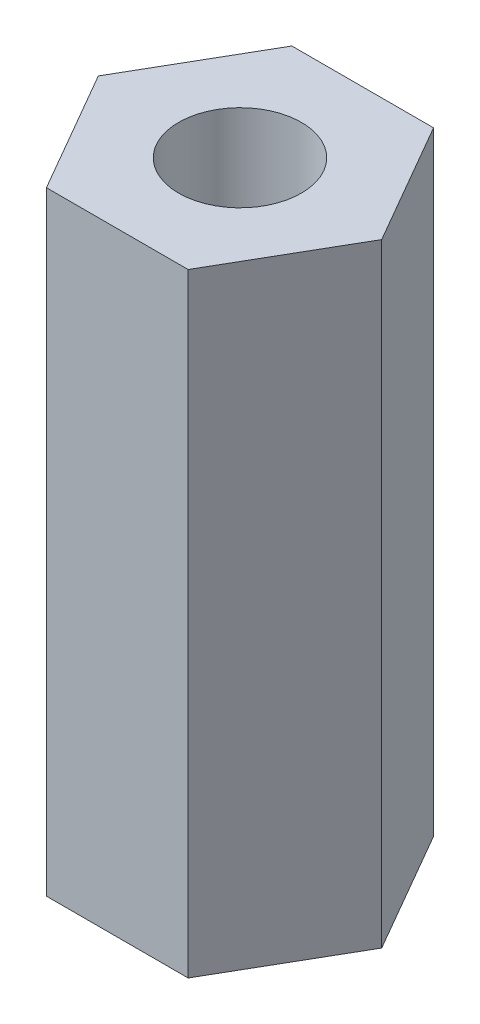
ISO-10303-21;
HEADER;
FILE_DESCRIPTION(('STEP AP214'),'2;1');
FILE_NAME('part.step','',(''),(''),'','','');
FILE_SCHEMA(('AUTOMOTIVE_DESIGN { 1 0 10303 214 1 1 1 1 }'));
ENDSEC;
DATA;
#1=APPLICATION_CONTEXT('core data for automotive mechanical design processes');
#2=APPLICATION_PROTOCOL_DEFINITION('international standard','automotive_design',2000,#1);
#3=PRODUCT_CONTEXT('',#1,'mechanical');
#4=PRODUCT('Part','Part','',(#3));
#5=PRODUCT_RELATED_PRODUCT_CATEGORY('part','',(#4));
#6=PRODUCT_DEFINITION_FORMATION('','',#4);
#7=PRODUCT_DEFINITION_CONTEXT('part definition',#1,'design');
#8=PRODUCT_DEFINITION('design','',#6,#7);
#9=PRODUCT_DEFINITION_SHAPE('','',#8);
#10=(LENGTH_UNIT() NAMED_UNIT(*) SI_UNIT(.MILLI.,.METRE.));
#11=(NAMED_UNIT(*) PLANE_ANGLE_UNIT() SI_UNIT($,.RADIAN.));
#12=(NAMED_UNIT(*) SI_UNIT($,.STERADIAN.) SOLID_ANGLE_UNIT());
#13=UNCERTAINTY_MEASURE_WITH_UNIT(LENGTH_MEASURE(1.E-05),#10,'distance_accuracy_value','');
#14=(GEOMETRIC_REPRESENTATION_CONTEXT(3) GLOBAL_UNCERTAINTY_ASSIGNED_CONTEXT((#13)) GLOBAL_UNIT_ASSIGNED_CONTEXT((#10,
#11,#12)) REPRESENTATION_CONTEXT('',''));
#15=CARTESIAN_POINT('',(0.,0.,0.));
#16=DIRECTION('',(0.,0.,1.));
#17=DIRECTION('',(1.,0.,0.));
#18=AXIS2_PLACEMENT_3D('',#15,#16,#17);
#19=CARTESIAN_POINT('',(0.,31.75,0.));
#20=DIRECTION('',(0.,1.,0.));
#21=DIRECTION('',(0.,0.,1.));
#22=AXIS2_PLACEMENT_3D('',#19,#20,#21);
#23=PLANE('',#22);
#24=DIRECTION('',(0.5,0.,-0.866025403784439));
#25=VECTOR('',#24,1.);
#26=CARTESIAN_POINT('',(3.66617420935413,31.75,6.35));
#27=LINE('',#26,#25);
#28=CARTESIAN_POINT('',(3.66617420935413,31.75,6.35));
#29=VERTEX_POINT('',#28);
#30=CARTESIAN_POINT('',(7.33234841870825,31.75,0.));
#31=VERTEX_POINT('',#30);
#32=EDGE_CURVE('E128',#29,#31,#27,.T.);
#33=ORIENTED_EDGE('',*,*,#32,.T.);
#34=DIRECTION('',(-0.5,0.,-0.866025403784439));
#35=VECTOR('',#34,1.);
#36=CARTESIAN_POINT('',(7.33234841870825,31.75,0.));
#37=LINE('',#36,#35);
#38=CARTESIAN_POINT('',(3.66617420935412,31.75,-6.35000000000001));
#39=VERTEX_POINT('',#38);
#40=EDGE_CURVE('E86',#31,#39,#37,.T.);
#41=ORIENTED_EDGE('',*,*,#40,.T.);
#42=DIRECTION('',(-1.,0.,0.));
#43=VECTOR('',#42,1.);
#44=CARTESIAN_POINT('',(3.66617420935412,31.75,-6.35000000000001));
#45=LINE('',#44,#43);
#46=CARTESIAN_POINT('',(-3.66617420935413,31.75,-6.35000000000001));
#47=VERTEX_POINT('',#46);
#48=EDGE_CURVE('E99',#39,#47,#45,.T.);
#49=ORIENTED_EDGE('',*,*,#48,.T.);
#50=DIRECTION('',(-0.5,0.,0.866025403784439));
#51=VECTOR('',#50,1.);
#52=CARTESIAN_POINT('',(-3.66617420935413,31.75,-6.35000000000001));
#53=LINE('',#52,#51);
#54=CARTESIAN_POINT('',(-7.33234841870825,31.75,0.));
#55=VERTEX_POINT('',#54);
#56=EDGE_CURVE('E93',#47,#55,#53,.T.);
#57=ORIENTED_EDGE('',*,*,#56,.T.);
#58=DIRECTION('',(0.5,0.,0.866025403784439));
#59=VECTOR('',#58,1.);
#60=CARTESIAN_POINT('',(-7.33234841870825,31.75,0.));
#61=LINE('',#60,#59);
#62=CARTESIAN_POINT('',(-3.66617420935413,31.75,6.35000000000001));
#63=VERTEX_POINT('',#62);
#64=EDGE_CURVE('E97',#55,#63,#61,.T.);
#65=ORIENTED_EDGE('',*,*,#64,.T.);
#66=DIRECTION('',(1.,0.,0.));
#67=VECTOR('',#66,1.);
#68=CARTESIAN_POINT('',(-3.66617420935413,31.75,6.35000000000001));
#69=LINE('',#68,#67);
#70=EDGE_CURVE('E49',#63,#29,#69,.T.);
#71=ORIENTED_EDGE('',*,*,#70,.T.);
#72=EDGE_LOOP('',(#33,#41,#49,#57,#65,#71));
#73=FACE_BOUND('',#72,.T.);
#74=CARTESIAN_POINT('',(0.,31.75,0.));
#75=DIRECTION('',(0.,1.,0.));
#76=DIRECTION('',(0.,0.,1.));
#77=AXIS2_PLACEMENT_3D('',#74,#75,#76);
#78=CIRCLE('',#77,3.175);
#79=CARTESIAN_POINT('',(0.,31.75,3.175));
#80=VERTEX_POINT('',#79);
#81=EDGE_CURVE('E121',#80,#80,#78,.T.);
#82=ORIENTED_EDGE('',*,*,#81,.F.);
#83=EDGE_LOOP('',(#82));
#84=FACE_BOUND('',#83,.T.);
#85=ADVANCED_FACE('F32',(#73,#84),#23,.T.);
#86=CARTESIAN_POINT('',(0.,0.,0.));
#87=DIRECTION('',(0.,1.,0.));
#88=DIRECTION('',(0.,0.,1.));
#89=AXIS2_PLACEMENT_3D('',#86,#87,#88);
#90=PLANE('',#89);
#91=DIRECTION('',(0.5,0.,-0.866025403784439));
#92=VECTOR('',#91,1.);
#93=CARTESIAN_POINT('',(3.66617420935413,0.,6.35));
#94=LINE('',#93,#92);
#95=CARTESIAN_POINT('',(3.66617420935413,0.,6.35));
#96=VERTEX_POINT('',#95);
#97=CARTESIAN_POINT('',(7.33234841870825,0.,0.));
#98=VERTEX_POINT('',#97);
#99=EDGE_CURVE('E117',#96,#98,#94,.T.);
#100=ORIENTED_EDGE('',*,*,#99,.F.);
#101=DIRECTION('',(1.,0.,0.));
#102=VECTOR('',#101,1.);
#103=CARTESIAN_POINT('',(-3.66617420935413,0.,6.35000000000001));
#104=LINE('',#103,#102);
#105=CARTESIAN_POINT('',(-3.66617420935413,0.,6.35000000000001));
#106=VERTEX_POINT('',#105);
#107=EDGE_CURVE('E78',#106,#96,#104,.T.);
#108=ORIENTED_EDGE('',*,*,#107,.F.);
#109=DIRECTION('',(0.5,0.,0.866025403784439));
#110=VECTOR('',#109,1.);
#111=CARTESIAN_POINT('',(-7.33234841870825,0.,0.));
#112=LINE('',#111,#110);
#113=CARTESIAN_POINT('',(-7.33234841870825,0.,0.));
#114=VERTEX_POINT('',#113);
#115=EDGE_CURVE('E72',#114,#106,#112,.T.);
#116=ORIENTED_EDGE('',*,*,#115,.F.);
#117=DIRECTION('',(-0.5,0.,0.866025403784439));
#118=VECTOR('',#117,1.);
#119=CARTESIAN_POINT('',(-3.66617420935413,0.,-6.35000000000001));
#120=LINE('',#119,#118);
#121=CARTESIAN_POINT('',(-3.66617420935413,0.,-6.35000000000001));
#122=VERTEX_POINT('',#121);
#123=EDGE_CURVE('E107',#122,#114,#120,.T.);
#124=ORIENTED_EDGE('',*,*,#123,.F.);
#125=DIRECTION('',(-1.,0.,0.));
#126=VECTOR('',#125,1.);
#127=CARTESIAN_POINT('',(3.66617420935412,0.,-6.35000000000001));
#128=LINE('',#127,#126);
#129=CARTESIAN_POINT('',(3.66617420935412,0.,-6.35000000000001));
#130=VERTEX_POINT('',#129);
#131=EDGE_CURVE('E123',#130,#122,#128,.T.);
#132=ORIENTED_EDGE('',*,*,#131,.F.);
#133=DIRECTION('',(-0.5,0.,-0.866025403784439));
#134=VECTOR('',#133,1.);
#135=CARTESIAN_POINT('',(7.33234841870825,0.,0.));
#136=LINE('',#135,#134);
#137=EDGE_CURVE('E120',#98,#130,#136,.T.);
#138=ORIENTED_EDGE('',*,*,#137,.F.);
#139=EDGE_LOOP('',(#100,#108,#116,#124,#132,#138));
#140=FACE_BOUND('',#139,.T.);
#141=CARTESIAN_POINT('',(0.,0.,0.));
#142=DIRECTION('',(0.,1.,0.));
#143=DIRECTION('',(0.,0.,1.));
#144=AXIS2_PLACEMENT_3D('',#141,#142,#143);
#145=CIRCLE('',#144,3.175);
#146=CARTESIAN_POINT('',(0.,0.,3.175));
#147=VERTEX_POINT('',#146);
#148=EDGE_CURVE('E221',#147,#147,#145,.T.);
#149=ORIENTED_EDGE('',*,*,#148,.T.);
#150=EDGE_LOOP('',(#149));
#151=FACE_BOUND('',#150,.T.);
#152=ADVANCED_FACE('F137',(#140,#151),#90,.F.);
#153=CARTESIAN_POINT('',(3.66617420935413,31.75,6.35));
#154=DIRECTION('',(-0.866025403784439,0.,-0.5));
#155=DIRECTION('',(-0.5,0.,0.866025403784439));
#156=AXIS2_PLACEMENT_3D('',#153,#154,#155);
#157=PLANE('',#156);
#158=ORIENTED_EDGE('',*,*,#99,.T.);
#159=DIRECTION('',(0.,-1.,0.));
#160=VECTOR('',#159,1.);
#161=CARTESIAN_POINT('',(7.33234841870825,31.75,0.));
#162=LINE('',#161,#160);
#163=EDGE_CURVE('E11',#31,#98,#162,.T.);
#164=ORIENTED_EDGE('',*,*,#163,.F.);
#165=ORIENTED_EDGE('',*,*,#32,.F.);
#166=DIRECTION('',(0.,-1.,0.));
#167=VECTOR('',#166,1.);
#168=CARTESIAN_POINT('',(3.66617420935413,31.75,6.35));
#169=LINE('',#168,#167);
#170=EDGE_CURVE('E113',#29,#96,#169,.T.);
#171=ORIENTED_EDGE('',*,*,#170,.T.);
#172=EDGE_LOOP('',(#158,#164,#165,#171));
#173=FACE_BOUND('',#172,.T.);
#174=ADVANCED_FACE('F34',(#173),#157,.F.);
#175=CARTESIAN_POINT('',(7.33234841870825,31.75,0.));
#176=DIRECTION('',(-0.866025403784439,0.,0.5));
#177=DIRECTION('',(0.5,0.,0.866025403784439));
#178=AXIS2_PLACEMENT_3D('',#175,#176,#177);
#179=PLANE('',#178);
#180=ORIENTED_EDGE('',*,*,#137,.T.);
#181=DIRECTION('',(0.,-1.,0.));
#182=VECTOR('',#181,1.);
#183=CARTESIAN_POINT('',(3.66617420935412,31.75,-6.35000000000001));
#184=LINE('',#183,#182);
#185=EDGE_CURVE('E41',#39,#130,#184,.T.);
#186=ORIENTED_EDGE('',*,*,#185,.F.);
#187=ORIENTED_EDGE('',*,*,#40,.F.);
#188=ORIENTED_EDGE('',*,*,#163,.T.);
#189=EDGE_LOOP('',(#180,#186,#187,#188));
#190=FACE_BOUND('',#189,.T.);
#191=ADVANCED_FACE('F162',(#190),#179,.F.);
#192=CARTESIAN_POINT('',(3.66617420935412,31.75,-6.35000000000001));
#193=DIRECTION('',(0.,0.,1.));
#194=DIRECTION('',(1.,0.,0.));
#195=AXIS2_PLACEMENT_3D('',#192,#193,#194);
#196=PLANE('',#195);
#197=ORIENTED_EDGE('',*,*,#131,.T.);
#198=DIRECTION('',(0.,-1.,0.));
#199=VECTOR('',#198,1.);
#200=CARTESIAN_POINT('',(-3.66617420935413,31.75,-6.35000000000001));
#201=LINE('',#200,#199);
#202=EDGE_CURVE('E108',#47,#122,#201,.T.);
#203=ORIENTED_EDGE('',*,*,#202,.F.);
#204=ORIENTED_EDGE('',*,*,#48,.F.);
#205=ORIENTED_EDGE('',*,*,#185,.T.);
#206=EDGE_LOOP('',(#197,#203,#204,#205));
#207=FACE_BOUND('',#206,.T.);
#208=ADVANCED_FACE('F134',(#207),#196,.F.);
#209=CARTESIAN_POINT('',(-3.66617420935413,31.75,-6.35000000000001));
#210=DIRECTION('',(0.866025403784439,0.,0.5));
#211=DIRECTION('',(0.5,0.,-0.866025403784439));
#212=AXIS2_PLACEMENT_3D('',#209,#210,#211);
#213=PLANE('',#212);
#214=ORIENTED_EDGE('',*,*,#123,.T.);
#215=DIRECTION('',(0.,-1.,0.));
#216=VECTOR('',#215,1.);
#217=CARTESIAN_POINT('',(-7.33234841870825,31.75,0.));
#218=LINE('',#217,#216);
#219=EDGE_CURVE('E104',#55,#114,#218,.T.);
#220=ORIENTED_EDGE('',*,*,#219,.F.);
#221=ORIENTED_EDGE('',*,*,#56,.F.);
#222=ORIENTED_EDGE('',*,*,#202,.T.);
#223=EDGE_LOOP('',(#214,#220,#221,#222));
#224=FACE_BOUND('',#223,.T.);
#225=ADVANCED_FACE('F105',(#224),#213,.F.);
#226=CARTESIAN_POINT('',(-7.33234841870825,31.75,0.));
#227=DIRECTION('',(0.866025403784439,0.,-0.5));
#228=DIRECTION('',(-0.5,0.,-0.866025403784439));
#229=AXIS2_PLACEMENT_3D('',#226,#227,#228);
#230=PLANE('',#229);
#231=ORIENTED_EDGE('',*,*,#115,.T.);
#232=DIRECTION('',(0.,-1.,0.));
#233=VECTOR('',#232,1.);
#234=CARTESIAN_POINT('',(-3.66617420935413,31.75,6.35000000000001));
#235=LINE('',#234,#233);
#236=EDGE_CURVE('E109',#63,#106,#235,.T.);
#237=ORIENTED_EDGE('',*,*,#236,.F.);
#238=ORIENTED_EDGE('',*,*,#64,.F.);
#239=ORIENTED_EDGE('',*,*,#219,.T.);
#240=EDGE_LOOP('',(#231,#237,#238,#239));
#241=FACE_BOUND('',#240,.T.);
#242=ADVANCED_FACE('F111',(#241),#230,.F.);
#243=CARTESIAN_POINT('',(-3.66617420935413,31.75,6.35000000000001));
#244=DIRECTION('',(0.,0.,-1.));
#245=DIRECTION('',(-1.,0.,0.));
#246=AXIS2_PLACEMENT_3D('',#243,#244,#245);
#247=PLANE('',#246);
#248=ORIENTED_EDGE('',*,*,#107,.T.);
#249=ORIENTED_EDGE('',*,*,#170,.F.);
#250=ORIENTED_EDGE('',*,*,#70,.F.);
#251=ORIENTED_EDGE('',*,*,#236,.T.);
#252=EDGE_LOOP('',(#248,#249,#250,#251));
#253=FACE_BOUND('',#252,.T.);
#254=ADVANCED_FACE('F142',(#253),#247,.F.);
#255=CARTESIAN_POINT('',(0.,31.75,0.));
#256=DIRECTION('',(0.,-1.,0.));
#257=DIRECTION('',(0.,0.,-1.));
#258=AXIS2_PLACEMENT_3D('',#255,#256,#257);
#259=CYLINDRICAL_SURFACE('',#258,3.175);
#260=ORIENTED_EDGE('',*,*,#81,.T.);
#261=EDGE_LOOP('',(#260));
#262=FACE_BOUND('',#261,.T.);
#263=ORIENTED_EDGE('',*,*,#148,.F.);
#264=EDGE_LOOP('',(#263));
#265=FACE_BOUND('',#264,.T.);
#266=ADVANCED_FACE('F144',(#262,#265),#259,.F.);
#267=CLOSED_SHELL('',(#85,#152,#174,#191,#208,#225,#242,#254,#266));
#268=MANIFOLD_SOLID_BREP('B2',#267);
#269=ADVANCED_BREP_SHAPE_REPRESENTATION('',(#18,#268),#14);
#270=SHAPE_DEFINITION_REPRESENTATION(#9,#269);
ENDSEC;
END-ISO-10303-21;
